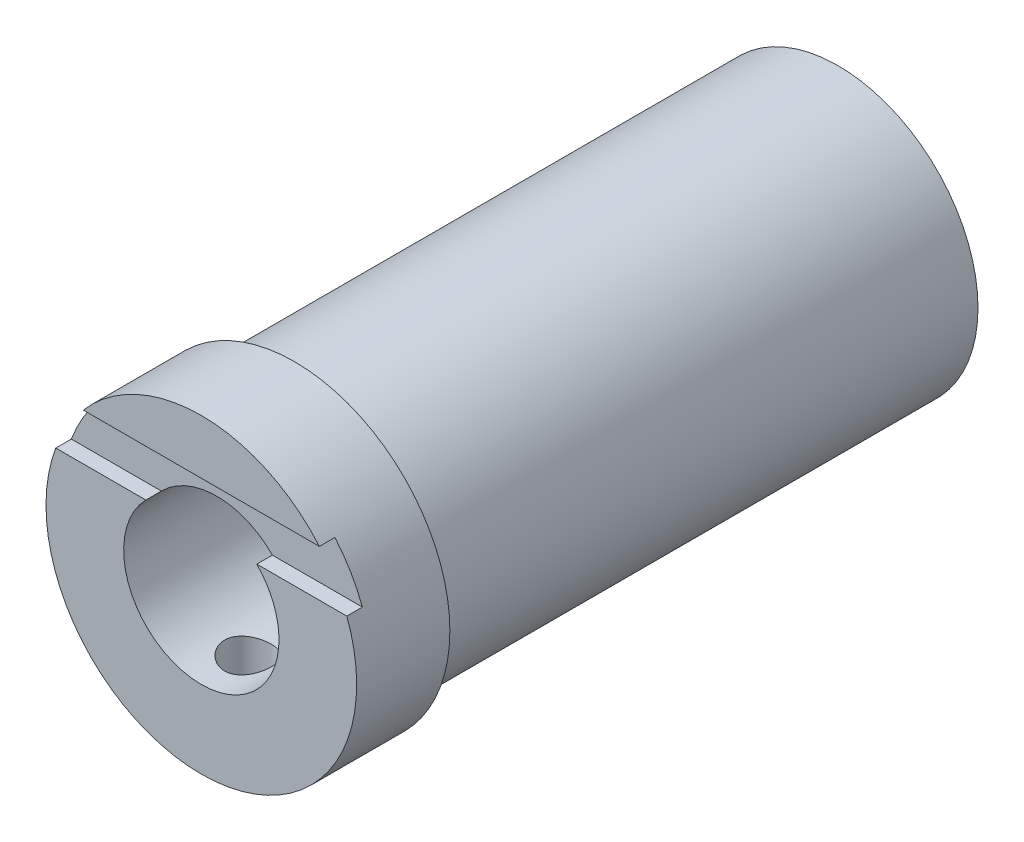
ISO-10303-21;
HEADER;
FILE_DESCRIPTION(('STEP AP214'),'2;1');
FILE_NAME('part.step','',(''),(''),'','','');
FILE_SCHEMA(('AUTOMOTIVE_DESIGN { 1 0 10303 214 1 1 1 1 }'));
ENDSEC;
DATA;
#1=APPLICATION_CONTEXT('core data for automotive mechanical design processes');
#2=APPLICATION_PROTOCOL_DEFINITION('international standard','automotive_design',2000,#1);
#3=PRODUCT_CONTEXT('',#1,'mechanical');
#4=PRODUCT('Part','Part','',(#3));
#5=PRODUCT_RELATED_PRODUCT_CATEGORY('part','',(#4));
#6=PRODUCT_DEFINITION_FORMATION('','',#4);
#7=PRODUCT_DEFINITION_CONTEXT('part definition',#1,'design');
#8=PRODUCT_DEFINITION('design','',#6,#7);
#9=PRODUCT_DEFINITION_SHAPE('','',#8);
#10=(LENGTH_UNIT() NAMED_UNIT(*) SI_UNIT(.MILLI.,.METRE.));
#11=(NAMED_UNIT(*) PLANE_ANGLE_UNIT() SI_UNIT($,.RADIAN.));
#12=(NAMED_UNIT(*) SI_UNIT($,.STERADIAN.) SOLID_ANGLE_UNIT());
#13=UNCERTAINTY_MEASURE_WITH_UNIT(LENGTH_MEASURE(1.E-05),#10,'distance_accuracy_value','');
#14=(GEOMETRIC_REPRESENTATION_CONTEXT(3) GLOBAL_UNCERTAINTY_ASSIGNED_CONTEXT((#13)) GLOBAL_UNIT_ASSIGNED_CONTEXT((#10,
#11,#12)) REPRESENTATION_CONTEXT('',''));
#15=CARTESIAN_POINT('',(0.,0.,0.));
#16=DIRECTION('',(0.,0.,1.));
#17=DIRECTION('',(1.,0.,0.));
#18=AXIS2_PLACEMENT_3D('',#15,#16,#17);
#19=CARTESIAN_POINT('',(0.,0.,41.));
#20=DIRECTION('',(0.,0.,1.));
#21=DIRECTION('',(1.,0.,0.));
#22=AXIS2_PLACEMENT_3D('',#19,#20,#21);
#23=PLANE('',#22);
#24=DIRECTION('',(1.,0.,0.));
#25=VECTOR('',#24,1.);
#26=CARTESIAN_POINT('',(-11.4750070683698,3.49904613494773,41.));
#27=LINE('',#26,#25);
#28=CARTESIAN_POINT('',(-9.3678533371049,3.49904613494773,41.));
#29=VERTEX_POINT('',#28);
#30=CARTESIAN_POINT('',(-3.57164893928664,3.49904613494773,41.));
#31=VERTEX_POINT('',#30);
#32=EDGE_CURVE('E130',#29,#31,#27,.T.);
#33=ORIENTED_EDGE('',*,*,#32,.F.);
#34=CARTESIAN_POINT('',(0.,0.,41.));
#35=DIRECTION('',(0.,0.,1.));
#36=DIRECTION('',(1.,0.,0.));
#37=AXIS2_PLACEMENT_3D('',#34,#35,#36);
#38=CIRCLE('',#37,10.);
#39=CARTESIAN_POINT('',(9.3678533371049,3.49904613494773,41.));
#40=VERTEX_POINT('',#39);
#41=EDGE_CURVE('E102',#29,#40,#38,.T.);
#42=ORIENTED_EDGE('',*,*,#41,.T.);
#43=CARTESIAN_POINT('',(3.57164893928664,3.49904613494773,41.));
#44=VERTEX_POINT('',#43);
#45=EDGE_CURVE('E94',#44,#40,#27,.T.);
#46=ORIENTED_EDGE('',*,*,#45,.F.);
#47=CARTESIAN_POINT('',(0.,0.,41.));
#48=DIRECTION('',(0.,0.,1.));
#49=DIRECTION('',(1.,0.,0.));
#50=AXIS2_PLACEMENT_3D('',#47,#48,#49);
#51=CIRCLE('',#50,5.);
#52=EDGE_CURVE('E111',#31,#44,#51,.T.);
#53=ORIENTED_EDGE('',*,*,#52,.F.);
#54=EDGE_LOOP('',(#33,#42,#46,#53));
#55=FACE_BOUND('',#54,.T.);
#56=ADVANCED_FACE('F33',(#55),#23,.T.);
#57=CARTESIAN_POINT('',(0.,0.,0.));
#58=DIRECTION('',(0.,0.,1.));
#59=DIRECTION('',(1.,0.,0.));
#60=AXIS2_PLACEMENT_3D('',#57,#58,#59);
#61=PLANE('',#60);
#62=CARTESIAN_POINT('',(0.,0.,0.));
#63=DIRECTION('',(0.,0.,1.));
#64=DIRECTION('',(1.,0.,0.));
#65=AXIS2_PLACEMENT_3D('',#62,#63,#64);
#66=CIRCLE('',#65,9.);
#67=CARTESIAN_POINT('',(9.,0.,0.));
#68=VERTEX_POINT('',#67);
#69=EDGE_CURVE('E105',#68,#68,#66,.T.);
#70=ORIENTED_EDGE('',*,*,#69,.F.);
#71=EDGE_LOOP('',(#70));
#72=FACE_BOUND('',#71,.T.);
#73=CARTESIAN_POINT('',(0.,0.,0.));
#74=DIRECTION('',(0.,0.,1.));
#75=DIRECTION('',(1.,0.,0.));
#76=AXIS2_PLACEMENT_3D('',#73,#74,#75);
#77=CIRCLE('',#76,5.);
#78=CARTESIAN_POINT('',(5.,0.,0.));
#79=VERTEX_POINT('',#78);
#80=EDGE_CURVE('E101',#79,#79,#77,.T.);
#81=ORIENTED_EDGE('',*,*,#80,.T.);
#82=EDGE_LOOP('',(#81));
#83=FACE_BOUND('',#82,.T.);
#84=ADVANCED_FACE('F194',(#72,#83),#61,.F.);
#85=CARTESIAN_POINT('',(0.,0.,35.));
#86=DIRECTION('',(0.,0.,-1.));
#87=DIRECTION('',(-1.,0.,0.));
#88=AXIS2_PLACEMENT_3D('',#85,#86,#87);
#89=CYLINDRICAL_SURFACE('',#88,9.);
#90=CARTESIAN_POINT('',(0.,0.,35.));
#91=DIRECTION('',(0.,0.,1.));
#92=DIRECTION('',(1.,0.,0.));
#93=AXIS2_PLACEMENT_3D('',#90,#91,#92);
#94=CIRCLE('',#93,9.);
#95=CARTESIAN_POINT('',(9.,0.,35.));
#96=VERTEX_POINT('',#95);
#97=EDGE_CURVE('E115',#96,#96,#94,.T.);
#98=ORIENTED_EDGE('',*,*,#97,.F.);
#99=EDGE_LOOP('',(#98));
#100=FACE_BOUND('',#99,.T.);
#101=ORIENTED_EDGE('',*,*,#69,.T.);
#102=EDGE_LOOP('',(#101));
#103=FACE_BOUND('',#102,.T.);
#104=ADVANCED_FACE('F35',(#100,#103),#89,.T.);
#105=CARTESIAN_POINT('',(0.,0.,35.));
#106=DIRECTION('',(0.,0.,-1.));
#107=DIRECTION('',(-1.,0.,0.));
#108=AXIS2_PLACEMENT_3D('',#105,#106,#107);
#109=CYLINDRICAL_SURFACE('',#108,5.);
#110=CARTESIAN_POINT('',(0.,-5.,39.5));
#111=CARTESIAN_POINT('',(-0.0822886127533002,-4.9999992925055,39.4999990025151));
#112=CARTESIAN_POINT('',(-0.16458731835153,-4.99794915693954,39.493206136376));
#113=CARTESIAN_POINT('',(-0.326788125304881,-4.98997105593691,39.4662786457779));
#114=CARTESIAN_POINT('',(-0.406689504411421,-4.98404193389692,39.4461400419767));
#115=CARTESIAN_POINT('',(-0.561732707754527,-4.96895552501836,39.3932539830897));
#116=CARTESIAN_POINT('',(-0.636881364395373,-4.95980300250425,39.3605251303811));
#117=CARTESIAN_POINT('',(-0.780624181053131,-4.93922109237645,39.2834639069442));
#118=CARTESIAN_POINT('',(-0.849217467469669,-4.92779140192067,39.2391299926046));
#119=CARTESIAN_POINT('',(-0.979871797183745,-4.90350737192774,39.1387759925273));
#120=CARTESIAN_POINT('',(-1.04171807124434,-4.89062383657036,39.0824833741141));
#121=CARTESIAN_POINT('',(-1.15524920923324,-4.86505834210442,38.9603907700898));
#122=CARTESIAN_POINT('',(-1.20693236327441,-4.85237641724501,38.894589187875));
#123=CARTESIAN_POINT('',(-1.29980037723708,-4.82834113993772,38.7535292469624));
#124=CARTESIAN_POINT('',(-1.34072309022214,-4.81702406663875,38.6780915390093));
#125=CARTESIAN_POINT('',(-1.4092139477476,-4.79743620394031,38.5210107457697));
#126=CARTESIAN_POINT('',(-1.43678529919973,-4.78916468313311,38.439369156072));
#127=CARTESIAN_POINT('',(-1.47701633682652,-4.77690870838434,38.2746097338695));
#128=CARTESIAN_POINT('',(-1.49007196234677,-4.77281069324533,38.1915972561361));
#129=CARTESIAN_POINT('',(-1.50213730614672,-4.76902789749767,38.0244668437832));
#130=CARTESIAN_POINT('',(-1.50115042761078,-4.76934204760571,37.9403491819409));
#131=CARTESIAN_POINT('',(-1.48546977199812,-4.77424744067778,37.7766160913915));
#132=CARTESIAN_POINT('',(-1.47127205262685,-4.7786838859914,37.6969477496378));
#133=CARTESIAN_POINT('',(-1.43037420427056,-4.79108356228624,37.5411802137265));
#134=CARTESIAN_POINT('',(-1.40367284141641,-4.79904714132351,37.4650813726257));
#135=CARTESIAN_POINT('',(-1.33816026653681,-4.81772733074973,37.3173996503393));
#136=CARTESIAN_POINT('',(-1.29918816934642,-4.82848016115952,37.2458929160447));
#137=CARTESIAN_POINT('',(-1.21035222588683,-4.85150987000065,37.1102679779898));
#138=CARTESIAN_POINT('',(-1.16048574002588,-4.86378711746991,37.0461515705862));
#139=CARTESIAN_POINT('',(-1.04881290765546,-4.88911011297937,36.924313809238));
#140=CARTESIAN_POINT('',(-0.986594907466972,-4.90216654310498,36.8669713359703));
#141=CARTESIAN_POINT('',(-0.853263259313966,-4.92712244063259,36.7634460159357));
#142=CARTESIAN_POINT('',(-0.782149051860887,-4.9390218351841,36.7172638715856));
#143=CARTESIAN_POINT('',(-0.632355038342803,-4.9604316006947,36.6371400775353));
#144=CARTESIAN_POINT('',(-0.55362774974795,-4.96992543668314,36.6032824837501));
#145=CARTESIAN_POINT('',(-0.391245415603519,-4.98533521832222,36.5494004099004));
#146=CARTESIAN_POINT('',(-0.307591751589581,-4.99125216186999,36.5293720714675));
#147=CARTESIAN_POINT('',(-0.140952242668331,-4.99868364643538,36.5043478221006));
#148=CARTESIAN_POINT('',(-0.0580500976011858,-5.0003485041779,36.4988384141984));
#149=CARTESIAN_POINT('',(0.107499605823385,-4.9995292324176,36.5015691557121));
#150=CARTESIAN_POINT('',(0.190147196690783,-4.99704565677756,36.5098074696514));
#151=CARTESIAN_POINT('',(0.350903605309699,-4.98830696987163,36.5393846111115));
#152=CARTESIAN_POINT('',(0.42907277261417,-4.98213829799417,36.5604233875809));
#153=CARTESIAN_POINT('',(0.580754638954522,-4.96674347841533,36.6146432327782));
#154=CARTESIAN_POINT('',(0.654266777025585,-4.95751696321085,36.6478257610379));
#155=CARTESIAN_POINT('',(0.796437189461054,-4.93669654351325,36.7262531654811));
#156=CARTESIAN_POINT('',(0.864943826199671,-4.92505280829675,36.771759340948));
#157=CARTESIAN_POINT('',(0.993523307980149,-4.90073468764317,36.8732247540528));
#158=CARTESIAN_POINT('',(1.05359403235594,-4.8880600443108,36.9291866118877));
#159=CARTESIAN_POINT('',(1.16585744551027,-4.86253171869138,37.0523873083693));
#160=CARTESIAN_POINT('',(1.21768481231504,-4.84968825033268,37.1199618757717));
#161=CARTESIAN_POINT('',(1.30928995072154,-4.82576515238464,37.2631279390135));
#162=CARTESIAN_POINT('',(1.34906803829472,-4.81468547654651,37.3387192245582));
#163=CARTESIAN_POINT('',(1.41517347127168,-4.79567189615055,37.4955324912547));
#164=CARTESIAN_POINT('',(1.4415634693705,-4.78772337843827,37.5767261865366));
#165=CARTESIAN_POINT('',(1.48021730815114,-4.77591594362794,37.7426879689315));
#166=CARTESIAN_POINT('',(1.49248598978779,-4.772055625083,37.8274548207877));
#167=CARTESIAN_POINT('',(1.50221984485059,-4.76899972496087,37.9943615183762));
#168=CARTESIAN_POINT('',(1.5002805530849,-4.76961647442754,38.0764636510176));
#169=CARTESIAN_POINT('',(1.48307505444813,-4.77499401288294,38.2391141033728));
#170=CARTESIAN_POINT('',(1.46780938124716,-4.77975463592551,38.3196624851764));
#171=CARTESIAN_POINT('',(1.42476888804136,-4.79275763670385,38.4759453991429));
#172=CARTESIAN_POINT('',(1.39715175507069,-4.80095604545965,38.5517272873617));
#173=CARTESIAN_POINT('',(1.33031507121129,-4.81990278909136,38.6976424388177));
#174=CARTESIAN_POINT('',(1.29109329962876,-4.83065161194312,38.7677746176408));
#175=CARTESIAN_POINT('',(1.20048763805072,-4.85397676425833,38.9031631165271));
#176=CARTESIAN_POINT('',(1.14871276092994,-4.86660540163798,38.9681487612604));
#177=CARTESIAN_POINT('',(1.03517434629782,-4.89201320450026,39.0887024983079));
#178=CARTESIAN_POINT('',(0.973408217134497,-4.90479240823905,39.1442681394678));
#179=CARTESIAN_POINT('',(0.839465762183243,-4.92950936570649,39.246023412295));
#180=CARTESIAN_POINT('',(0.767037885790604,-4.94141159765674,39.2918914468555));
#181=CARTESIAN_POINT('',(0.615141373983529,-4.96260680455813,39.370735169904));
#182=CARTESIAN_POINT('',(0.535676052998955,-4.97190099931067,39.4037168882745));
#183=CARTESIAN_POINT('',(0.380757712655282,-4.98602174969301,39.4528952756528));
#184=CARTESIAN_POINT('',(0.305786961954235,-4.99122027381068,39.4705116728833));
#185=CARTESIAN_POINT('',(0.15388019523078,-4.99820944494492,39.4940635252416));
#186=CARTESIAN_POINT('',(0.0769445098581397,-5.0000006615474,39.5000009327048));
#187=CARTESIAN_POINT('',(0.,-5.,39.5));
#188=B_SPLINE_CURVE_WITH_KNOTS('',3,(#110,#111,#112,#113,#114,#115,#116,#117,#118,#119,#120,
#121,#122,#123,#124,#125,#126,#127,#128,#129,#130,#131,#132,#133,#134,#135,#136,#137,#138,#139,
#140,#141,#142,#143,#144,#145,#146,#147,#148,#149,#150,#151,#152,#153,#154,#155,#156,#157,#158,
#159,#160,#161,#162,#163,#164,#165,#166,#167,#168,#169,#170,#171,#172,#173,#174,#175,#176,#177,
#178,#179,#180,#181,#182,#183,#184,#185,#186,#187),.UNSPECIFIED.,.T.,.F.,(4,2,2,2,2,2,2,2,2,2,2,
2,2,2,2,2,2,2,2,2,2,2,2,2,2,2,2,2,2,2,2,2,2,2,2,2,2,2,4),(0.,0.246583203612611,0.493239964846,
0.739533676300873,0.985860164412702,1.23855602948191,1.49129437288633,1.74971481004109,
2.00807314543224,2.25919689356599,2.51025978319089,2.75226016697676,2.99428443658002,
3.2396242644712,3.48502360158556,3.74067104048167,3.99633456531072,4.25371046881689,
4.51101453528808,4.75908809438545,5.00712853550327,5.24956746682327,5.49203554593729,
5.74011305702908,5.98825282000191,6.24540400322819,6.50254844252681,6.75847814951252,
7.01432009460283,7.25950155466943,7.504673196616,7.74680040402721,7.98897397553107,
8.23996925679931,8.49102974897503,8.74942996156671,9.00770911595235,9.2383169193046,
9.46888616948875),.UNSPECIFIED.);
#189=CARTESIAN_POINT('',(0.,-5.,39.5));
#190=VERTEX_POINT('',#189);
#191=EDGE_CURVE('E157',#190,#190,#188,.T.);
#192=ORIENTED_EDGE('',*,*,#191,.T.);
#193=EDGE_LOOP('',(#192));
#194=FACE_BOUND('',#193,.T.);
#195=DIRECTION('',(0.,0.,-1.));
#196=VECTOR('',#195,1.);
#197=CARTESIAN_POINT('',(-3.57164893928664,3.49904613494773,35.));
#198=LINE('',#197,#196);
#199=CARTESIAN_POINT('',(-3.57164893928664,3.49904613494773,40.));
#200=VERTEX_POINT('',#199);
#201=EDGE_CURVE('E147',#31,#200,#198,.T.);
#202=ORIENTED_EDGE('',*,*,#201,.F.);
#203=ORIENTED_EDGE('',*,*,#52,.T.);
#204=DIRECTION('',(0.,0.,-1.));
#205=VECTOR('',#204,1.);
#206=CARTESIAN_POINT('',(3.57164893928664,3.49904613494773,35.));
#207=LINE('',#206,#205);
#208=CARTESIAN_POINT('',(3.57164893928664,3.49904613494773,40.));
#209=VERTEX_POINT('',#208);
#210=EDGE_CURVE('E146',#209,#44,#207,.F.);
#211=ORIENTED_EDGE('',*,*,#210,.F.);
#212=CARTESIAN_POINT('',(0.,0.,40.));
#213=DIRECTION('',(0.,0.,1.));
#214=DIRECTION('',(1.,0.,0.));
#215=AXIS2_PLACEMENT_3D('',#212,#213,#214);
#216=CIRCLE('',#215,5.);
#217=EDGE_CURVE('E143',#209,#200,#216,.T.);
#218=ORIENTED_EDGE('',*,*,#217,.T.);
#219=EDGE_LOOP('',(#202,#203,#211,#218));
#220=FACE_BOUND('',#219,.T.);
#221=ORIENTED_EDGE('',*,*,#80,.F.);
#222=EDGE_LOOP('',(#221));
#223=FACE_BOUND('',#222,.T.);
#224=ADVANCED_FACE('F150',(#194,#220,#223),#109,.F.);
#225=DIRECTION('',(-1.,0.,0.));
#226=VECTOR('',#225,1.);
#227=CARTESIAN_POINT('',(-11.4750070683698,6.49904613494773,41.));
#228=LINE('',#227,#226);
#229=CARTESIAN_POINT('',(7.60015784940162,6.49904613494773,41.));
#230=VERTEX_POINT('',#229);
#231=CARTESIAN_POINT('',(-7.60015784940162,6.49904613494773,41.));
#232=VERTEX_POINT('',#231);
#233=EDGE_CURVE('E86',#230,#232,#228,.T.);
#234=ORIENTED_EDGE('',*,*,#233,.F.);
#235=EDGE_CURVE('E93',#230,#232,#38,.T.);
#236=ORIENTED_EDGE('',*,*,#235,.T.);
#237=EDGE_LOOP('',(#234,#236));
#238=FACE_BOUND('',#237,.T.);
#239=ADVANCED_FACE('F92',(#238),#23,.T.);
#240=CARTESIAN_POINT('',(0.,0.,35.));
#241=DIRECTION('',(0.,0.,1.));
#242=DIRECTION('',(1.,0.,0.));
#243=AXIS2_PLACEMENT_3D('',#240,#241,#242);
#244=PLANE('',#243);
#245=ORIENTED_EDGE('',*,*,#97,.T.);
#246=EDGE_LOOP('',(#245));
#247=FACE_BOUND('',#246,.T.);
#248=CARTESIAN_POINT('',(0.,0.,35.));
#249=DIRECTION('',(0.,0.,1.));
#250=DIRECTION('',(1.,0.,0.));
#251=AXIS2_PLACEMENT_3D('',#248,#249,#250);
#252=CIRCLE('',#251,10.);
#253=CARTESIAN_POINT('',(10.,0.,35.));
#254=VERTEX_POINT('',#253);
#255=EDGE_CURVE('E108',#254,#254,#252,.T.);
#256=ORIENTED_EDGE('',*,*,#255,.F.);
#257=EDGE_LOOP('',(#256));
#258=FACE_BOUND('',#257,.T.);
#259=ADVANCED_FACE('F185',(#247,#258),#244,.F.);
#260=CARTESIAN_POINT('',(0.,0.,41.));
#261=DIRECTION('',(0.,0.,-1.));
#262=DIRECTION('',(-1.,0.,0.));
#263=AXIS2_PLACEMENT_3D('',#260,#261,#262);
#264=CYLINDRICAL_SURFACE('',#263,10.);
#265=CARTESIAN_POINT('',(0.,-10.,39.5));
#266=CARTESIAN_POINT('',(-0.0837515444816424,-9.99999865771297,39.4999965461848));
#267=CARTESIAN_POINT('',(-0.167551685082133,-9.9989368253704,39.4929619991594));
#268=CARTESIAN_POINT('',(-0.332809627994914,-9.99480315973187,39.4650168000173));
#269=CARTESIAN_POINT('',(-0.414265068974229,-9.99172936938473,39.4440926370551));
#270=CARTESIAN_POINT('',(-0.572418086221861,-9.98391721219526,39.3890074950324));
#271=CARTESIAN_POINT('',(-0.649119207826801,-9.97918010370919,39.3548565204941));
#272=CARTESIAN_POINT('',(-0.795690428635256,-9.96856475911724,39.2743116205831));
#273=CARTESIAN_POINT('',(-0.86556147472519,-9.96268668152773,39.2279193955826));
#274=CARTESIAN_POINT('',(-0.997046719562127,-9.95039170991452,39.1238227350601));
#275=CARTESIAN_POINT('',(-1.0585998322255,-9.94397133890331,39.0660415437918));
#276=CARTESIAN_POINT('',(-1.17117490668949,-9.93134261133238,38.9409723111061));
#277=CARTESIAN_POINT('',(-1.22219626272936,-9.92513426698505,38.8736837232215));
#278=CARTESIAN_POINT('',(-1.31249729499943,-9.91359877458726,38.7310993564775));
#279=CARTESIAN_POINT('',(-1.35171787037205,-9.90827611975031,38.6557657530187));
#280=CARTESIAN_POINT('',(-1.41692632171056,-9.89916211306268,38.4994871793546));
#281=CARTESIAN_POINT('',(-1.44291491889163,-9.89537067775448,38.4185425152561));
#282=CARTESIAN_POINT('',(-1.48073198798911,-9.88978256218673,38.2539819581283));
#283=CARTESIAN_POINT('',(-1.49266503640518,-9.8879711574125,38.170390606592));
#284=CARTESIAN_POINT('',(-1.50235624033932,-9.88650348970582,38.0023738340127));
#285=CARTESIAN_POINT('',(-1.50011520973796,-9.88684710303147,37.9179484611375));
#286=CARTESIAN_POINT('',(-1.48160733250787,-9.88963718352409,37.7513989198059));
#287=CARTESIAN_POINT('',(-1.4654569592775,-9.89206618761549,37.6692614735152));
#288=CARTESIAN_POINT('',(-1.41977117403734,-9.89872608126367,37.5088756311285));
#289=CARTESIAN_POINT('',(-1.39023538337812,-9.90295702179379,37.4306273451193));
#290=CARTESIAN_POINT('',(-1.31849603529736,-9.91276335545481,37.2798866287171));
#291=CARTESIAN_POINT('',(-1.27624314283198,-9.91834396766526,37.2074180309076));
#292=CARTESIAN_POINT('',(-1.18030413128955,-9.93021707574548,37.0705554042181));
#293=CARTESIAN_POINT('',(-1.12661726182478,-9.93650961832501,37.0061619057306));
#294=CARTESIAN_POINT('',(-1.00869493078248,-9.94917473056209,36.8866023392603));
#295=CARTESIAN_POINT('',(-0.944359329642002,-9.95554747112815,36.8315350097137));
#296=CARTESIAN_POINT('',(-0.807307089894187,-9.96759647648462,36.7329640654927));
#297=CARTESIAN_POINT('',(-0.73459041458817,-9.9732727382251,36.6894605014561));
#298=CARTESIAN_POINT('',(-0.582754598213685,-9.98329515585393,36.6152469135005));
#299=CARTESIAN_POINT('',(-0.503631677836779,-9.98764051925428,36.5845445081597));
#300=CARTESIAN_POINT('',(-0.341273182487059,-9.99450490557069,36.5368906103146));
#301=CARTESIAN_POINT('',(-0.2580378859526,-9.99702405195467,36.5199381881844));
#302=CARTESIAN_POINT('',(-0.0906695676436457,-9.99993581133871,36.5003967701833));
#303=CARTESIAN_POINT('',(-0.00655273187046964,-10.0003485209039,36.4976720286207));
#304=CARTESIAN_POINT('',(0.160936677662284,-9.99905561015226,36.506303005311));
#305=CARTESIAN_POINT('',(0.244309274381879,-9.99735005541369,36.5176582876681));
#306=CARTESIAN_POINT('',(0.407532387431411,-9.99202468615333,36.5540141001775));
#307=CARTESIAN_POINT('',(0.487397963079841,-9.98841415207984,36.5789484960308));
#308=CARTESIAN_POINT('',(0.641814958643002,-9.97968235658369,36.6416849974618));
#309=CARTESIAN_POINT('',(0.716366128795101,-9.97456102421565,36.6794877073336));
#310=CARTESIAN_POINT('',(0.858634979291923,-9.96332682468686,36.7672062245639));
#311=CARTESIAN_POINT('',(0.92629900989157,-9.95720701626745,36.8172081400128));
#312=CARTESIAN_POINT('',(1.05232367317771,-9.94467863012165,36.9277858116288));
#313=CARTESIAN_POINT('',(1.11068376479341,-9.93827003562867,36.9883621823247));
#314=CARTESIAN_POINT('',(1.21693784957196,-9.92582264304494,37.1189735331765));
#315=CARTESIAN_POINT('',(1.26474084747421,-9.91978736017588,37.1890829251948));
#316=CARTESIAN_POINT('',(1.34789129270584,-9.90883219104903,37.3364160405118));
#317=CARTESIAN_POINT('',(1.38323907656436,-9.90391227465628,37.4136395715215));
#318=CARTESIAN_POINT('',(1.44033467323944,-9.89577033008645,37.5727375336231));
#319=CARTESIAN_POINT('',(1.46213037141636,-9.89254233006438,37.6545944609712));
#320=CARTESIAN_POINT('',(1.49165549501586,-9.88813382297802,37.8208590154351));
#321=CARTESIAN_POINT('',(1.49938589183067,-9.88695317451771,37.9052664659947));
#322=CARTESIAN_POINT('',(1.5005378666944,-9.88677832610841,38.0733290633158));
#323=CARTESIAN_POINT('',(1.49410252167313,-9.88776226333502,38.1569832417569));
#324=CARTESIAN_POINT('',(1.46741229544379,-9.89175820611174,38.3220052633235));
#325=CARTESIAN_POINT('',(1.44715743638627,-9.89477020841118,38.4033731101134));
#326=CARTESIAN_POINT('',(1.39345373518665,-9.90247526112297,38.5614730822343));
#327=CARTESIAN_POINT('',(1.36001489324314,-9.90716703716075,38.6382086704334));
#328=CARTESIAN_POINT('',(1.28090667642309,-9.91770454557702,38.7850036338024));
#329=CARTESIAN_POINT('',(1.23523688741502,-9.92355031702724,38.8550627828036));
#330=CARTESIAN_POINT('',(1.13244337659164,-9.93580743364938,38.9872430579752));
#331=CARTESIAN_POINT('',(1.07521369039805,-9.94222367881967,39.0492813332471));
#332=CARTESIAN_POINT('',(0.951148841082829,-9.95485788826636,39.1629245547878));
#333=CARTESIAN_POINT('',(0.884311448350937,-9.96107580610759,39.2145270725762));
#334=CARTESIAN_POINT('',(0.742495707543718,-9.9726518579052,39.3060876766074));
#335=CARTESIAN_POINT('',(0.667474576764755,-9.9780050712882,39.3459801092148));
#336=CARTESIAN_POINT('',(0.511751870248714,-9.98720028802959,39.412538516758));
#337=CARTESIAN_POINT('',(0.431056277096701,-9.99104385565757,39.4392181900537));
#338=CARTESIAN_POINT('',(0.291665727889328,-9.99590939261505,39.4725413427101));
#339=CARTESIAN_POINT('',(0.233831133495277,-9.99743549179557,39.4828226015388));
#340=CARTESIAN_POINT('',(0.117338971600124,-9.99948125947896,39.4965530977126));
#341=CARTESIAN_POINT('',(0.0586814143344168,-10.0000009404877,39.5000024199526));
#342=CARTESIAN_POINT('',(0.,-10.,39.5));
#343=B_SPLINE_CURVE_WITH_KNOTS('',3,(#265,#266,#267,#268,#269,#270,#271,#272,#273,#274,#275,
#276,#277,#278,#279,#280,#281,#282,#283,#284,#285,#286,#287,#288,#289,#290,#291,#292,#293,#294,
#295,#296,#297,#298,#299,#300,#301,#302,#303,#304,#305,#306,#307,#308,#309,#310,#311,#312,#313,
#314,#315,#316,#317,#318,#319,#320,#321,#322,#323,#324,#325,#326,#327,#328,#329,#330,#331,#332,
#333,#334,#335,#336,#337,#338,#339,#340,#341,#342),.UNSPECIFIED.,.T.,.F.,(4,2,2,2,2,2,2,2,2,2,2,
2,2,2,2,2,2,2,2,2,2,2,2,2,2,2,2,2,2,2,2,2,2,2,2,2,2,2,4),(0.,0.251040205031664,
0.502324962929152,0.753420023583238,1.0044802241976,1.25729416136843,1.5101226357258,
1.76419702395376,2.01825756225507,2.27041564605925,2.52255925098983,2.77261177195747,
3.02267136690362,3.27371383476159,3.52477278308534,3.77834291255409,4.03191415238668,
4.28563608984875,4.53934087193401,4.79062058544255,5.04189251991155,5.29195148965948,
5.54202220376274,5.79391188036908,6.0458162002863,6.29981366584672,6.55380426808833,
6.80689223457168,7.05996272137178,7.31048888261065,7.56101464229564,7.81135073984146,
8.0616953146688,8.31444829965721,8.56726003468734,8.82146323384734,9.07540233261442,
9.25129851978808,9.42719252123291),.UNSPECIFIED.);
#344=CARTESIAN_POINT('',(0.,-10.,39.5));
#345=VERTEX_POINT('',#344);
#346=EDGE_CURVE('E95',#345,#345,#343,.T.);
#347=ORIENTED_EDGE('',*,*,#346,.F.);
#348=EDGE_LOOP('',(#347));
#349=FACE_BOUND('',#348,.T.);
#350=CARTESIAN_POINT('',(0.,0.,40.));
#351=DIRECTION('',(0.,0.,1.));
#352=DIRECTION('',(1.,0.,0.));
#353=AXIS2_PLACEMENT_3D('',#350,#351,#352);
#354=CIRCLE('',#353,10.);
#355=CARTESIAN_POINT('',(9.3678533371049,3.49904613494773,40.));
#356=VERTEX_POINT('',#355);
#357=CARTESIAN_POINT('',(7.60015784940162,6.49904613494773,40.));
#358=VERTEX_POINT('',#357);
#359=EDGE_CURVE('E53',#356,#358,#354,.T.);
#360=ORIENTED_EDGE('',*,*,#359,.F.);
#361=DIRECTION('',(0.,0.,-1.));
#362=VECTOR('',#361,1.);
#363=CARTESIAN_POINT('',(9.3678533371049,3.49904613494773,41.));
#364=LINE('',#363,#362);
#365=EDGE_CURVE('E11',#356,#40,#364,.F.);
#366=ORIENTED_EDGE('',*,*,#365,.T.);
#367=ORIENTED_EDGE('',*,*,#41,.F.);
#368=DIRECTION('',(0.,0.,-1.));
#369=VECTOR('',#368,1.);
#370=CARTESIAN_POINT('',(-9.3678533371049,3.49904613494773,41.));
#371=LINE('',#370,#369);
#372=CARTESIAN_POINT('',(-9.3678533371049,3.49904613494773,40.));
#373=VERTEX_POINT('',#372);
#374=EDGE_CURVE('E123',#29,#373,#371,.T.);
#375=ORIENTED_EDGE('',*,*,#374,.T.);
#376=CARTESIAN_POINT('',(-7.60015784940162,6.49904613494773,40.));
#377=VERTEX_POINT('',#376);
#378=EDGE_CURVE('E118',#377,#373,#354,.T.);
#379=ORIENTED_EDGE('',*,*,#378,.F.);
#380=DIRECTION('',(0.,0.,-1.));
#381=VECTOR('',#380,1.);
#382=CARTESIAN_POINT('',(-7.60015784940162,6.49904613494773,41.));
#383=LINE('',#382,#381);
#384=EDGE_CURVE('E100',#377,#232,#383,.F.);
#385=ORIENTED_EDGE('',*,*,#384,.T.);
#386=ORIENTED_EDGE('',*,*,#235,.F.);
#387=DIRECTION('',(0.,0.,-1.));
#388=VECTOR('',#387,1.);
#389=CARTESIAN_POINT('',(7.60015784940162,6.49904613494773,41.));
#390=LINE('',#389,#388);
#391=EDGE_CURVE('E41',#230,#358,#390,.T.);
#392=ORIENTED_EDGE('',*,*,#391,.T.);
#393=EDGE_LOOP('',(#360,#366,#367,#375,#379,#385,#386,#392));
#394=FACE_BOUND('',#393,.T.);
#395=ORIENTED_EDGE('',*,*,#255,.T.);
#396=EDGE_LOOP('',(#395));
#397=FACE_BOUND('',#396,.T.);
#398=ADVANCED_FACE('F97',(#349,#394,#397),#264,.T.);
#399=CARTESIAN_POINT('',(-11.4750070683698,3.49904613494773,40.));
#400=DIRECTION('',(0.,-1.,0.));
#401=DIRECTION('',(0.,0.,-1.));
#402=AXIS2_PLACEMENT_3D('',#399,#400,#401);
#403=PLANE('',#402);
#404=ORIENTED_EDGE('',*,*,#201,.T.);
#405=DIRECTION('',(1.,0.,0.));
#406=VECTOR('',#405,1.);
#407=CARTESIAN_POINT('',(-11.4750070683698,3.49904613494773,40.));
#408=LINE('',#407,#406);
#409=EDGE_CURVE('E133',#373,#200,#408,.T.);
#410=ORIENTED_EDGE('',*,*,#409,.F.);
#411=ORIENTED_EDGE('',*,*,#374,.F.);
#412=ORIENTED_EDGE('',*,*,#32,.T.);
#413=EDGE_LOOP('',(#404,#410,#411,#412));
#414=FACE_BOUND('',#413,.T.);
#415=ADVANCED_FACE('F129',(#414),#403,.F.);
#416=ORIENTED_EDGE('',*,*,#210,.T.);
#417=ORIENTED_EDGE('',*,*,#45,.T.);
#418=ORIENTED_EDGE('',*,*,#365,.F.);
#419=EDGE_CURVE('E139',#209,#356,#408,.T.);
#420=ORIENTED_EDGE('',*,*,#419,.F.);
#421=EDGE_LOOP('',(#416,#417,#418,#420));
#422=FACE_BOUND('',#421,.T.);
#423=ADVANCED_FACE('F155',(#422),#403,.F.);
#424=CARTESIAN_POINT('',(-11.4750070683698,6.49904613494773,40.));
#425=DIRECTION('',(0.,1.,0.));
#426=DIRECTION('',(0.,0.,1.));
#427=AXIS2_PLACEMENT_3D('',#424,#425,#426);
#428=PLANE('',#427);
#429=ORIENTED_EDGE('',*,*,#233,.T.);
#430=ORIENTED_EDGE('',*,*,#384,.F.);
#431=DIRECTION('',(-1.,0.,0.));
#432=VECTOR('',#431,1.);
#433=CARTESIAN_POINT('',(-11.4750070683698,6.49904613494773,40.));
#434=LINE('',#433,#432);
#435=EDGE_CURVE('E48',#358,#377,#434,.T.);
#436=ORIENTED_EDGE('',*,*,#435,.F.);
#437=ORIENTED_EDGE('',*,*,#391,.F.);
#438=EDGE_LOOP('',(#429,#430,#436,#437));
#439=FACE_BOUND('',#438,.T.);
#440=ADVANCED_FACE('F85',(#439),#428,.F.);
#441=CARTESIAN_POINT('',(0.,0.,40.));
#442=DIRECTION('',(0.,0.,1.));
#443=DIRECTION('',(1.,0.,0.));
#444=AXIS2_PLACEMENT_3D('',#441,#442,#443);
#445=PLANE('',#444);
#446=ORIENTED_EDGE('',*,*,#419,.T.);
#447=ORIENTED_EDGE('',*,*,#359,.T.);
#448=ORIENTED_EDGE('',*,*,#435,.T.);
#449=ORIENTED_EDGE('',*,*,#378,.T.);
#450=ORIENTED_EDGE('',*,*,#409,.T.);
#451=ORIENTED_EDGE('',*,*,#217,.F.);
#452=EDGE_LOOP('',(#446,#447,#448,#449,#450,#451));
#453=FACE_BOUND('',#452,.T.);
#454=ADVANCED_FACE('F153',(#453),#445,.T.);
#455=CARTESIAN_POINT('',(0.,-10.001,38.));
#456=DIRECTION('',(0.,1.,0.));
#457=DIRECTION('',(0.,0.,1.));
#458=AXIS2_PLACEMENT_3D('',#455,#456,#457);
#459=CYLINDRICAL_SURFACE('',#458,1.5);
#460=ORIENTED_EDGE('',*,*,#191,.F.);
#461=EDGE_LOOP('',(#460));
#462=FACE_BOUND('',#461,.T.);
#463=ORIENTED_EDGE('',*,*,#346,.T.);
#464=EDGE_LOOP('',(#463));
#465=FACE_BOUND('',#464,.T.);
#466=ADVANCED_FACE('F169',(#462,#465),#459,.F.);
#467=CLOSED_SHELL('',(#56,#84,#104,#224,#239,#259,#398,#415,#423,#440,#454,#466));
#468=MANIFOLD_SOLID_BREP('B2',#467);
#469=ADVANCED_BREP_SHAPE_REPRESENTATION('',(#18,#468),#14);
#470=SHAPE_DEFINITION_REPRESENTATION(#9,#469);
ENDSEC;
END-ISO-10303-21;
